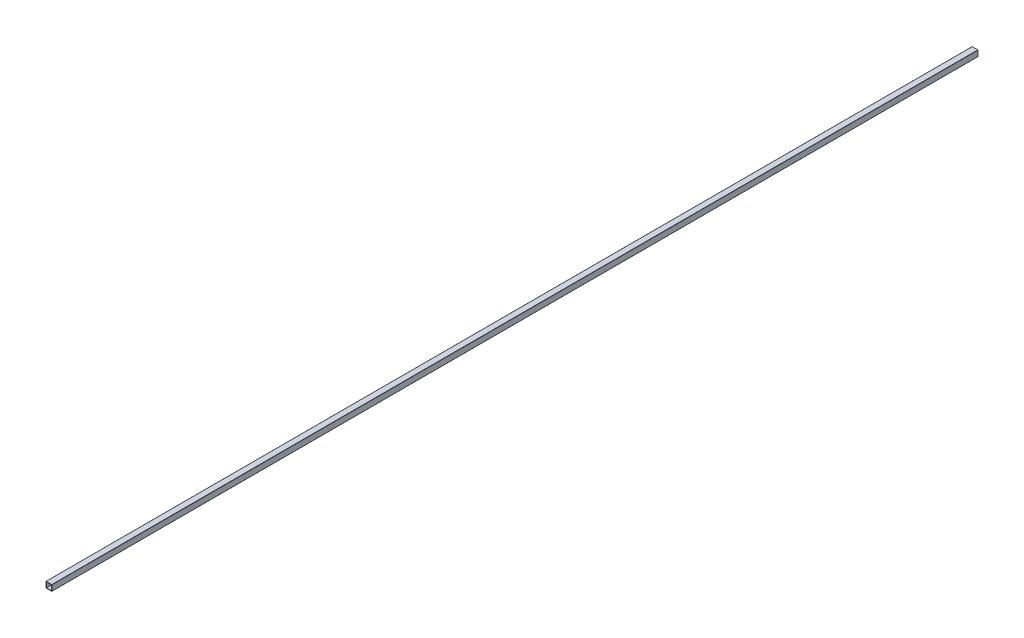
ISO-10303-21;
HEADER;
FILE_DESCRIPTION(('STEP AP214'),'2;1');
FILE_NAME('part.step','',(''),(''),'','','');
FILE_SCHEMA(('AUTOMOTIVE_DESIGN { 1 0 10303 214 1 1 1 1 }'));
ENDSEC;
DATA;
#1=APPLICATION_CONTEXT('core data for automotive mechanical design processes');
#2=APPLICATION_PROTOCOL_DEFINITION('international standard','automotive_design',2000,#1);
#3=PRODUCT_CONTEXT('',#1,'mechanical');
#4=PRODUCT('Part','Part','',(#3));
#5=PRODUCT_RELATED_PRODUCT_CATEGORY('part','',(#4));
#6=PRODUCT_DEFINITION_FORMATION('','',#4);
#7=PRODUCT_DEFINITION_CONTEXT('part definition',#1,'design');
#8=PRODUCT_DEFINITION('design','',#6,#7);
#9=PRODUCT_DEFINITION_SHAPE('','',#8);
#10=(LENGTH_UNIT() NAMED_UNIT(*) SI_UNIT(.MILLI.,.METRE.));
#11=(NAMED_UNIT(*) PLANE_ANGLE_UNIT() SI_UNIT($,.RADIAN.));
#12=(NAMED_UNIT(*) SI_UNIT($,.STERADIAN.) SOLID_ANGLE_UNIT());
#13=UNCERTAINTY_MEASURE_WITH_UNIT(LENGTH_MEASURE(1.E-05),#10,'distance_accuracy_value','');
#14=(GEOMETRIC_REPRESENTATION_CONTEXT(3) GLOBAL_UNCERTAINTY_ASSIGNED_CONTEXT((#13)) GLOBAL_UNIT_ASSIGNED_CONTEXT((#10,
#11,#12)) REPRESENTATION_CONTEXT('',''));
#15=CARTESIAN_POINT('',(0.,0.,0.));
#16=DIRECTION('',(0.,0.,1.));
#17=DIRECTION('',(1.,0.,0.));
#18=AXIS2_PLACEMENT_3D('',#15,#16,#17);
#19=CARTESIAN_POINT('',(18.05,18.05,6000.));
#20=DIRECTION('',(0.,0.,-1.));
#21=DIRECTION('',(-1.,0.,0.));
#22=AXIS2_PLACEMENT_3D('',#19,#20,#21);
#23=PLANE('',#22);
#24=CARTESIAN_POINT('',(18.05,18.05,6000.));
#25=DIRECTION('',(0.,0.,1.));
#26=DIRECTION('',(-1.,0.,0.));
#27=AXIS2_PLACEMENT_3D('',#24,#25,#26);
#28=CIRCLE('',#27,1.);
#29=CARTESIAN_POINT('',(19.05,18.05,6000.));
#30=VERTEX_POINT('',#29);
#31=CARTESIAN_POINT('',(18.05,19.05,6000.));
#32=VERTEX_POINT('',#31);
#33=EDGE_CURVE('E158',#30,#32,#28,.T.);
#34=ORIENTED_EDGE('',*,*,#33,.T.);
#35=DIRECTION('',(-1.,0.,0.));
#36=VECTOR('',#35,1.);
#37=CARTESIAN_POINT('',(-18.05,19.05,6000.));
#38=LINE('',#37,#36);
#39=CARTESIAN_POINT('',(-18.05,19.05,6000.));
#40=VERTEX_POINT('',#39);
#41=EDGE_CURVE('E161',#32,#40,#38,.T.);
#42=ORIENTED_EDGE('',*,*,#41,.T.);
#43=CARTESIAN_POINT('',(-18.05,18.05,6000.));
#44=DIRECTION('',(0.,0.,1.));
#45=DIRECTION('',(-1.,0.,0.));
#46=AXIS2_PLACEMENT_3D('',#43,#44,#45);
#47=CIRCLE('',#46,1.);
#48=CARTESIAN_POINT('',(-19.05,18.05,6000.));
#49=VERTEX_POINT('',#48);
#50=EDGE_CURVE('E164',#40,#49,#47,.T.);
#51=ORIENTED_EDGE('',*,*,#50,.T.);
#52=DIRECTION('',(0.,-1.,0.));
#53=VECTOR('',#52,1.);
#54=CARTESIAN_POINT('',(-19.05,-18.05,6000.));
#55=LINE('',#54,#53);
#56=CARTESIAN_POINT('',(-19.05,-18.05,6000.));
#57=VERTEX_POINT('',#56);
#58=EDGE_CURVE('E166',#49,#57,#55,.T.);
#59=ORIENTED_EDGE('',*,*,#58,.T.);
#60=CARTESIAN_POINT('',(-18.05,-18.05,6000.));
#61=DIRECTION('',(0.,0.,1.));
#62=DIRECTION('',(-1.,0.,0.));
#63=AXIS2_PLACEMENT_3D('',#60,#61,#62);
#64=CIRCLE('',#63,1.);
#65=CARTESIAN_POINT('',(-18.05,-19.05,6000.));
#66=VERTEX_POINT('',#65);
#67=EDGE_CURVE('E168',#57,#66,#64,.T.);
#68=ORIENTED_EDGE('',*,*,#67,.T.);
#69=DIRECTION('',(1.,0.,0.));
#70=VECTOR('',#69,1.);
#71=CARTESIAN_POINT('',(-18.05,-19.05,6000.));
#72=LINE('',#71,#70);
#73=CARTESIAN_POINT('',(18.05,-19.05,6000.));
#74=VERTEX_POINT('',#73);
#75=EDGE_CURVE('E170',#66,#74,#72,.T.);
#76=ORIENTED_EDGE('',*,*,#75,.T.);
#77=CARTESIAN_POINT('',(18.05,-18.05,6000.));
#78=DIRECTION('',(0.,0.,1.));
#79=DIRECTION('',(1.,0.,0.));
#80=AXIS2_PLACEMENT_3D('',#77,#78,#79);
#81=CIRCLE('',#80,1.);
#82=CARTESIAN_POINT('',(19.05,-18.05,6000.));
#83=VERTEX_POINT('',#82);
#84=EDGE_CURVE('E172',#74,#83,#81,.T.);
#85=ORIENTED_EDGE('',*,*,#84,.T.);
#86=DIRECTION('',(0.,1.,0.));
#87=VECTOR('',#86,1.);
#88=CARTESIAN_POINT('',(19.05,-18.05,6000.));
#89=LINE('',#88,#87);
#90=EDGE_CURVE('E174',#83,#30,#89,.T.);
#91=ORIENTED_EDGE('',*,*,#90,.T.);
#92=EDGE_LOOP('',(#34,#42,#51,#59,#68,#76,#85,#91));
#93=FACE_BOUND('',#92,.T.);
#94=DIRECTION('',(1.,0.,0.));
#95=VECTOR('',#94,1.);
#96=CARTESIAN_POINT('',(-16.39,-16.39,6000.));
#97=LINE('',#96,#95);
#98=CARTESIAN_POINT('',(-16.39,-16.39,6000.));
#99=VERTEX_POINT('',#98);
#100=CARTESIAN_POINT('',(16.39,-16.39,6000.));
#101=VERTEX_POINT('',#100);
#102=EDGE_CURVE('E122',#99,#101,#97,.T.);
#103=ORIENTED_EDGE('',*,*,#102,.F.);
#104=DIRECTION('',(0.,-1.,0.));
#105=VECTOR('',#104,1.);
#106=CARTESIAN_POINT('',(-16.39,-16.39,6000.));
#107=LINE('',#106,#105);
#108=CARTESIAN_POINT('',(-16.39,16.39,6000.));
#109=VERTEX_POINT('',#108);
#110=EDGE_CURVE('E144',#109,#99,#107,.T.);
#111=ORIENTED_EDGE('',*,*,#110,.F.);
#112=DIRECTION('',(-1.,0.,0.));
#113=VECTOR('',#112,1.);
#114=CARTESIAN_POINT('',(-16.39,16.39,6000.));
#115=LINE('',#114,#113);
#116=CARTESIAN_POINT('',(16.39,16.39,6000.));
#117=VERTEX_POINT('',#116);
#118=EDGE_CURVE('E142',#117,#109,#115,.T.);
#119=ORIENTED_EDGE('',*,*,#118,.F.);
#120=DIRECTION('',(0.,1.,0.));
#121=VECTOR('',#120,1.);
#122=CARTESIAN_POINT('',(16.39,-16.39,6000.));
#123=LINE('',#122,#121);
#124=EDGE_CURVE('E130',#101,#117,#123,.T.);
#125=ORIENTED_EDGE('',*,*,#124,.F.);
#126=EDGE_LOOP('',(#103,#111,#119,#125));
#127=FACE_BOUND('',#126,.T.);
#128=ADVANCED_FACE('F33',(#93,#127),#23,.F.);
#129=CARTESIAN_POINT('',(18.05,18.05,0.));
#130=DIRECTION('',(0.,0.,-1.));
#131=DIRECTION('',(-1.,0.,0.));
#132=AXIS2_PLACEMENT_3D('',#129,#130,#131);
#133=PLANE('',#132);
#134=CARTESIAN_POINT('',(18.05,18.05,0.));
#135=DIRECTION('',(0.,0.,1.));
#136=DIRECTION('',(-1.,0.,0.));
#137=AXIS2_PLACEMENT_3D('',#134,#135,#136);
#138=CIRCLE('',#137,1.);
#139=CARTESIAN_POINT('',(19.05,18.05,0.));
#140=VERTEX_POINT('',#139);
#141=CARTESIAN_POINT('',(18.05,19.05,0.));
#142=VERTEX_POINT('',#141);
#143=EDGE_CURVE('E138',#140,#142,#138,.T.);
#144=ORIENTED_EDGE('',*,*,#143,.F.);
#145=DIRECTION('',(0.,1.,0.));
#146=VECTOR('',#145,1.);
#147=CARTESIAN_POINT('',(19.05,-18.05,0.));
#148=LINE('',#147,#146);
#149=CARTESIAN_POINT('',(19.05,-18.05,0.));
#150=VERTEX_POINT('',#149);
#151=EDGE_CURVE('E162',#150,#140,#148,.T.);
#152=ORIENTED_EDGE('',*,*,#151,.F.);
#153=CARTESIAN_POINT('',(18.05,-18.05,0.));
#154=DIRECTION('',(0.,0.,1.));
#155=DIRECTION('',(1.,0.,0.));
#156=AXIS2_PLACEMENT_3D('',#153,#154,#155);
#157=CIRCLE('',#156,1.);
#158=CARTESIAN_POINT('',(18.05,-19.05,0.));
#159=VERTEX_POINT('',#158);
#160=EDGE_CURVE('E189',#159,#150,#157,.T.);
#161=ORIENTED_EDGE('',*,*,#160,.F.);
#162=DIRECTION('',(1.,0.,0.));
#163=VECTOR('',#162,1.);
#164=CARTESIAN_POINT('',(-18.05,-19.05,0.));
#165=LINE('',#164,#163);
#166=CARTESIAN_POINT('',(-18.05,-19.05,0.));
#167=VERTEX_POINT('',#166);
#168=EDGE_CURVE('E187',#167,#159,#165,.T.);
#169=ORIENTED_EDGE('',*,*,#168,.F.);
#170=CARTESIAN_POINT('',(-18.05,-18.05,0.));
#171=DIRECTION('',(0.,0.,1.));
#172=DIRECTION('',(-1.,0.,0.));
#173=AXIS2_PLACEMENT_3D('',#170,#171,#172);
#174=CIRCLE('',#173,1.);
#175=CARTESIAN_POINT('',(-19.05,-18.05,0.));
#176=VERTEX_POINT('',#175);
#177=EDGE_CURVE('E185',#176,#167,#174,.T.);
#178=ORIENTED_EDGE('',*,*,#177,.F.);
#179=DIRECTION('',(0.,-1.,0.));
#180=VECTOR('',#179,1.);
#181=CARTESIAN_POINT('',(-19.05,-18.05,0.));
#182=LINE('',#181,#180);
#183=CARTESIAN_POINT('',(-19.05,18.05,0.));
#184=VERTEX_POINT('',#183);
#185=EDGE_CURVE('E183',#184,#176,#182,.T.);
#186=ORIENTED_EDGE('',*,*,#185,.F.);
#187=CARTESIAN_POINT('',(-18.05,18.05,0.));
#188=DIRECTION('',(0.,0.,1.));
#189=DIRECTION('',(-1.,0.,0.));
#190=AXIS2_PLACEMENT_3D('',#187,#188,#189);
#191=CIRCLE('',#190,1.);
#192=CARTESIAN_POINT('',(-18.05,19.05,0.));
#193=VERTEX_POINT('',#192);
#194=EDGE_CURVE('E181',#193,#184,#191,.T.);
#195=ORIENTED_EDGE('',*,*,#194,.F.);
#196=DIRECTION('',(-1.,0.,0.));
#197=VECTOR('',#196,1.);
#198=CARTESIAN_POINT('',(-18.05,19.05,0.));
#199=LINE('',#198,#197);
#200=EDGE_CURVE('E179',#142,#193,#199,.T.);
#201=ORIENTED_EDGE('',*,*,#200,.F.);
#202=EDGE_LOOP('',(#144,#152,#161,#169,#178,#186,#195,#201));
#203=FACE_BOUND('',#202,.T.);
#204=DIRECTION('',(0.,-1.,0.));
#205=VECTOR('',#204,1.);
#206=CARTESIAN_POINT('',(-16.39,-16.39,0.));
#207=LINE('',#206,#205);
#208=CARTESIAN_POINT('',(-16.39,16.39,0.));
#209=VERTEX_POINT('',#208);
#210=CARTESIAN_POINT('',(-16.39,-16.39,0.));
#211=VERTEX_POINT('',#210);
#212=EDGE_CURVE('E131',#209,#211,#207,.T.);
#213=ORIENTED_EDGE('',*,*,#212,.T.);
#214=DIRECTION('',(1.,0.,0.));
#215=VECTOR('',#214,1.);
#216=CARTESIAN_POINT('',(-16.39,-16.39,0.));
#217=LINE('',#216,#215);
#218=CARTESIAN_POINT('',(16.39,-16.39,0.));
#219=VERTEX_POINT('',#218);
#220=EDGE_CURVE('E56',#211,#219,#217,.T.);
#221=ORIENTED_EDGE('',*,*,#220,.T.);
#222=DIRECTION('',(0.,1.,0.));
#223=VECTOR('',#222,1.);
#224=CARTESIAN_POINT('',(16.39,-16.39,0.));
#225=LINE('',#224,#223);
#226=CARTESIAN_POINT('',(16.39,16.39,0.));
#227=VERTEX_POINT('',#226);
#228=EDGE_CURVE('E137',#219,#227,#225,.T.);
#229=ORIENTED_EDGE('',*,*,#228,.T.);
#230=DIRECTION('',(-1.,0.,0.));
#231=VECTOR('',#230,1.);
#232=CARTESIAN_POINT('',(-16.39,16.39,0.));
#233=LINE('',#232,#231);
#234=EDGE_CURVE('E150',#227,#209,#233,.T.);
#235=ORIENTED_EDGE('',*,*,#234,.T.);
#236=EDGE_LOOP('',(#213,#221,#229,#235));
#237=FACE_BOUND('',#236,.T.);
#238=ADVANCED_FACE('F219',(#203,#237),#133,.T.);
#239=CARTESIAN_POINT('',(18.05,18.05,6000.));
#240=DIRECTION('',(0.,0.,-1.));
#241=DIRECTION('',(-1.,0.,0.));
#242=AXIS2_PLACEMENT_3D('',#239,#240,#241);
#243=CYLINDRICAL_SURFACE('',#242,1.);
#244=ORIENTED_EDGE('',*,*,#143,.T.);
#245=DIRECTION('',(0.,0.,-1.));
#246=VECTOR('',#245,1.);
#247=CARTESIAN_POINT('',(18.05,19.05,6000.));
#248=LINE('',#247,#246);
#249=EDGE_CURVE('E11',#32,#142,#248,.T.);
#250=ORIENTED_EDGE('',*,*,#249,.F.);
#251=ORIENTED_EDGE('',*,*,#33,.F.);
#252=DIRECTION('',(0.,0.,-1.));
#253=VECTOR('',#252,1.);
#254=CARTESIAN_POINT('',(19.05,18.05,6000.));
#255=LINE('',#254,#253);
#256=EDGE_CURVE('E176',#30,#140,#255,.T.);
#257=ORIENTED_EDGE('',*,*,#256,.T.);
#258=EDGE_LOOP('',(#244,#250,#251,#257));
#259=FACE_BOUND('',#258,.T.);
#260=ADVANCED_FACE('F35',(#259),#243,.T.);
#261=CARTESIAN_POINT('',(-18.05,19.05,6000.));
#262=DIRECTION('',(0.,-1.,0.));
#263=DIRECTION('',(0.,0.,-1.));
#264=AXIS2_PLACEMENT_3D('',#261,#262,#263);
#265=PLANE('',#264);
#266=ORIENTED_EDGE('',*,*,#200,.T.);
#267=DIRECTION('',(0.,0.,-1.));
#268=VECTOR('',#267,1.);
#269=CARTESIAN_POINT('',(-18.05,19.05,6000.));
#270=LINE('',#269,#268);
#271=EDGE_CURVE('E41',#40,#193,#270,.T.);
#272=ORIENTED_EDGE('',*,*,#271,.F.);
#273=ORIENTED_EDGE('',*,*,#41,.F.);
#274=ORIENTED_EDGE('',*,*,#249,.T.);
#275=EDGE_LOOP('',(#266,#272,#273,#274));
#276=FACE_BOUND('',#275,.T.);
#277=ADVANCED_FACE('F236',(#276),#265,.F.);
#278=CARTESIAN_POINT('',(-18.05,18.05,6000.));
#279=DIRECTION('',(0.,0.,-1.));
#280=DIRECTION('',(-1.,0.,0.));
#281=AXIS2_PLACEMENT_3D('',#278,#279,#280);
#282=CYLINDRICAL_SURFACE('',#281,1.);
#283=ORIENTED_EDGE('',*,*,#194,.T.);
#284=DIRECTION('',(0.,0.,-1.));
#285=VECTOR('',#284,1.);
#286=CARTESIAN_POINT('',(-19.05,18.05,6000.));
#287=LINE('',#286,#285);
#288=EDGE_CURVE('E206',#49,#184,#287,.T.);
#289=ORIENTED_EDGE('',*,*,#288,.F.);
#290=ORIENTED_EDGE('',*,*,#50,.F.);
#291=ORIENTED_EDGE('',*,*,#271,.T.);
#292=EDGE_LOOP('',(#283,#289,#290,#291));
#293=FACE_BOUND('',#292,.T.);
#294=ADVANCED_FACE('F213',(#293),#282,.T.);
#295=CARTESIAN_POINT('',(-19.05,-18.05,6000.));
#296=DIRECTION('',(1.,0.,0.));
#297=DIRECTION('',(0.,0.,-1.));
#298=AXIS2_PLACEMENT_3D('',#295,#296,#297);
#299=PLANE('',#298);
#300=ORIENTED_EDGE('',*,*,#185,.T.);
#301=DIRECTION('',(0.,0.,-1.));
#302=VECTOR('',#301,1.);
#303=CARTESIAN_POINT('',(-19.05,-18.05,6000.));
#304=LINE('',#303,#302);
#305=EDGE_CURVE('E203',#57,#176,#304,.T.);
#306=ORIENTED_EDGE('',*,*,#305,.F.);
#307=ORIENTED_EDGE('',*,*,#58,.F.);
#308=ORIENTED_EDGE('',*,*,#288,.T.);
#309=EDGE_LOOP('',(#300,#306,#307,#308));
#310=FACE_BOUND('',#309,.T.);
#311=ADVANCED_FACE('F225',(#310),#299,.F.);
#312=CARTESIAN_POINT('',(-18.05,-18.05,6000.));
#313=DIRECTION('',(0.,0.,-1.));
#314=DIRECTION('',(-1.,0.,0.));
#315=AXIS2_PLACEMENT_3D('',#312,#313,#314);
#316=CYLINDRICAL_SURFACE('',#315,1.);
#317=ORIENTED_EDGE('',*,*,#177,.T.);
#318=DIRECTION('',(0.,0.,-1.));
#319=VECTOR('',#318,1.);
#320=CARTESIAN_POINT('',(-18.05,-19.05,6000.));
#321=LINE('',#320,#319);
#322=EDGE_CURVE('E200',#66,#167,#321,.T.);
#323=ORIENTED_EDGE('',*,*,#322,.F.);
#324=ORIENTED_EDGE('',*,*,#67,.F.);
#325=ORIENTED_EDGE('',*,*,#305,.T.);
#326=EDGE_LOOP('',(#317,#323,#324,#325));
#327=FACE_BOUND('',#326,.T.);
#328=ADVANCED_FACE('F229',(#327),#316,.T.);
#329=CARTESIAN_POINT('',(-18.05,-19.05,6000.));
#330=DIRECTION('',(0.,1.,0.));
#331=DIRECTION('',(0.,0.,1.));
#332=AXIS2_PLACEMENT_3D('',#329,#330,#331);
#333=PLANE('',#332);
#334=ORIENTED_EDGE('',*,*,#168,.T.);
#335=DIRECTION('',(0.,0.,-1.));
#336=VECTOR('',#335,1.);
#337=CARTESIAN_POINT('',(18.05,-19.05,6000.));
#338=LINE('',#337,#336);
#339=EDGE_CURVE('E197',#74,#159,#338,.T.);
#340=ORIENTED_EDGE('',*,*,#339,.F.);
#341=ORIENTED_EDGE('',*,*,#75,.F.);
#342=ORIENTED_EDGE('',*,*,#322,.T.);
#343=EDGE_LOOP('',(#334,#340,#341,#342));
#344=FACE_BOUND('',#343,.T.);
#345=ADVANCED_FACE('F249',(#344),#333,.F.);
#346=CARTESIAN_POINT('',(18.05,-18.05,6000.));
#347=DIRECTION('',(0.,0.,-1.));
#348=DIRECTION('',(-1.,0.,0.));
#349=AXIS2_PLACEMENT_3D('',#346,#347,#348);
#350=CYLINDRICAL_SURFACE('',#349,1.);
#351=ORIENTED_EDGE('',*,*,#160,.T.);
#352=DIRECTION('',(0.,0.,-1.));
#353=VECTOR('',#352,1.);
#354=CARTESIAN_POINT('',(19.05,-18.05,6000.));
#355=LINE('',#354,#353);
#356=EDGE_CURVE('E194',#83,#150,#355,.T.);
#357=ORIENTED_EDGE('',*,*,#356,.F.);
#358=ORIENTED_EDGE('',*,*,#84,.F.);
#359=ORIENTED_EDGE('',*,*,#339,.T.);
#360=EDGE_LOOP('',(#351,#357,#358,#359));
#361=FACE_BOUND('',#360,.T.);
#362=ADVANCED_FACE('F247',(#361),#350,.T.);
#363=CARTESIAN_POINT('',(19.05,-18.05,6000.));
#364=DIRECTION('',(-1.,0.,0.));
#365=DIRECTION('',(0.,0.,1.));
#366=AXIS2_PLACEMENT_3D('',#363,#364,#365);
#367=PLANE('',#366);
#368=ORIENTED_EDGE('',*,*,#151,.T.);
#369=ORIENTED_EDGE('',*,*,#256,.F.);
#370=ORIENTED_EDGE('',*,*,#90,.F.);
#371=ORIENTED_EDGE('',*,*,#356,.T.);
#372=EDGE_LOOP('',(#368,#369,#370,#371));
#373=FACE_BOUND('',#372,.T.);
#374=ADVANCED_FACE('F242',(#373),#367,.F.);
#375=CARTESIAN_POINT('',(-16.39,-16.39,6000.));
#376=DIRECTION('',(0.,1.,0.));
#377=DIRECTION('',(0.,0.,1.));
#378=AXIS2_PLACEMENT_3D('',#375,#376,#377);
#379=PLANE('',#378);
#380=ORIENTED_EDGE('',*,*,#220,.F.);
#381=DIRECTION('',(0.,0.,-1.));
#382=VECTOR('',#381,1.);
#383=CARTESIAN_POINT('',(-16.39,-16.39,6000.));
#384=LINE('',#383,#382);
#385=EDGE_CURVE('E126',#99,#211,#384,.T.);
#386=ORIENTED_EDGE('',*,*,#385,.F.);
#387=ORIENTED_EDGE('',*,*,#102,.T.);
#388=DIRECTION('',(0.,0.,-1.));
#389=VECTOR('',#388,1.);
#390=CARTESIAN_POINT('',(16.39,-16.39,6000.));
#391=LINE('',#390,#389);
#392=EDGE_CURVE('E125',#101,#219,#391,.T.);
#393=ORIENTED_EDGE('',*,*,#392,.T.);
#394=EDGE_LOOP('',(#380,#386,#387,#393));
#395=FACE_BOUND('',#394,.T.);
#396=ADVANCED_FACE('F124',(#395),#379,.T.);
#397=CARTESIAN_POINT('',(16.39,-16.39,6000.));
#398=DIRECTION('',(-1.,0.,0.));
#399=DIRECTION('',(0.,0.,1.));
#400=AXIS2_PLACEMENT_3D('',#397,#398,#399);
#401=PLANE('',#400);
#402=ORIENTED_EDGE('',*,*,#228,.F.);
#403=ORIENTED_EDGE('',*,*,#392,.F.);
#404=ORIENTED_EDGE('',*,*,#124,.T.);
#405=DIRECTION('',(0.,0.,-1.));
#406=VECTOR('',#405,1.);
#407=CARTESIAN_POINT('',(16.39,16.39,6000.));
#408=LINE('',#407,#406);
#409=EDGE_CURVE('E139',#117,#227,#408,.T.);
#410=ORIENTED_EDGE('',*,*,#409,.T.);
#411=EDGE_LOOP('',(#402,#403,#404,#410));
#412=FACE_BOUND('',#411,.T.);
#413=ADVANCED_FACE('F134',(#412),#401,.T.);
#414=CARTESIAN_POINT('',(-16.39,16.39,6000.));
#415=DIRECTION('',(0.,-1.,0.));
#416=DIRECTION('',(0.,0.,-1.));
#417=AXIS2_PLACEMENT_3D('',#414,#415,#416);
#418=PLANE('',#417);
#419=ORIENTED_EDGE('',*,*,#234,.F.);
#420=ORIENTED_EDGE('',*,*,#409,.F.);
#421=ORIENTED_EDGE('',*,*,#118,.T.);
#422=DIRECTION('',(0.,0.,-1.));
#423=VECTOR('',#422,1.);
#424=CARTESIAN_POINT('',(-16.39,16.39,6000.));
#425=LINE('',#424,#423);
#426=EDGE_CURVE('E48',#109,#209,#425,.T.);
#427=ORIENTED_EDGE('',*,*,#426,.T.);
#428=EDGE_LOOP('',(#419,#420,#421,#427));
#429=FACE_BOUND('',#428,.T.);
#430=ADVANCED_FACE('F274',(#429),#418,.T.);
#431=CARTESIAN_POINT('',(-16.39,-16.39,6000.));
#432=DIRECTION('',(1.,0.,0.));
#433=DIRECTION('',(0.,0.,-1.));
#434=AXIS2_PLACEMENT_3D('',#431,#432,#433);
#435=PLANE('',#434);
#436=ORIENTED_EDGE('',*,*,#212,.F.);
#437=ORIENTED_EDGE('',*,*,#426,.F.);
#438=ORIENTED_EDGE('',*,*,#110,.T.);
#439=ORIENTED_EDGE('',*,*,#385,.T.);
#440=EDGE_LOOP('',(#436,#437,#438,#439));
#441=FACE_BOUND('',#440,.T.);
#442=ADVANCED_FACE('F278',(#441),#435,.T.);
#443=CLOSED_SHELL('',(#128,#238,#260,#277,#294,#311,#328,#345,#362,#374,#396,#413,#430,#442));
#444=MANIFOLD_SOLID_BREP('B2',#443);
#445=ADVANCED_BREP_SHAPE_REPRESENTATION('',(#18,#444),#14);
#446=SHAPE_DEFINITION_REPRESENTATION(#9,#445);
ENDSEC;
END-ISO-10303-21;
